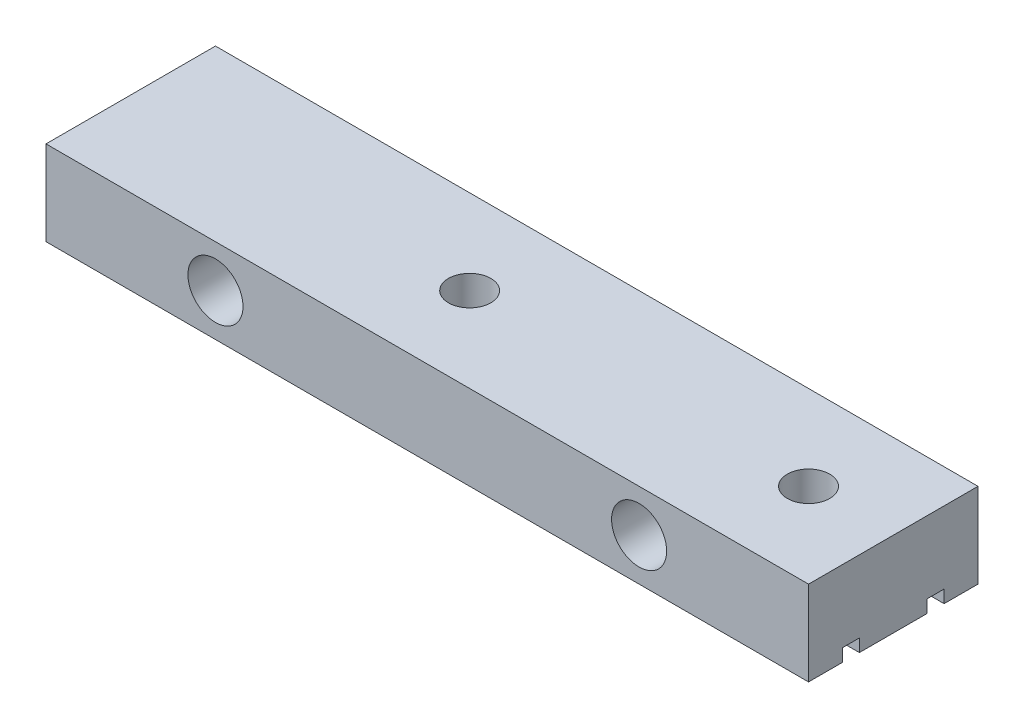
ISO-10303-21;
HEADER;
FILE_DESCRIPTION(('STEP AP214'),'2;1');
FILE_NAME('part.step','',(''),(''),'','','');
FILE_SCHEMA(('AUTOMOTIVE_DESIGN { 1 0 10303 214 1 1 1 1 }'));
ENDSEC;
DATA;
#1=APPLICATION_CONTEXT('core data for automotive mechanical design processes');
#2=APPLICATION_PROTOCOL_DEFINITION('international standard','automotive_design',2000,#1);
#3=PRODUCT_CONTEXT('',#1,'mechanical');
#4=PRODUCT('Part','Part','',(#3));
#5=PRODUCT_RELATED_PRODUCT_CATEGORY('part','',(#4));
#6=PRODUCT_DEFINITION_FORMATION('','',#4);
#7=PRODUCT_DEFINITION_CONTEXT('part definition',#1,'design');
#8=PRODUCT_DEFINITION('design','',#6,#7);
#9=PRODUCT_DEFINITION_SHAPE('','',#8);
#10=(LENGTH_UNIT() NAMED_UNIT(*) SI_UNIT(.MILLI.,.METRE.));
#11=(NAMED_UNIT(*) PLANE_ANGLE_UNIT() SI_UNIT($,.RADIAN.));
#12=(NAMED_UNIT(*) SI_UNIT($,.STERADIAN.) SOLID_ANGLE_UNIT());
#13=UNCERTAINTY_MEASURE_WITH_UNIT(LENGTH_MEASURE(1.E-05),#10,'distance_accuracy_value','');
#14=(GEOMETRIC_REPRESENTATION_CONTEXT(3) GLOBAL_UNCERTAINTY_ASSIGNED_CONTEXT((#13)) GLOBAL_UNIT_ASSIGNED_CONTEXT((#10,
#11,#12)) REPRESENTATION_CONTEXT('',''));
#15=CARTESIAN_POINT('',(0.,0.,0.));
#16=DIRECTION('',(0.,0.,1.));
#17=DIRECTION('',(1.,0.,0.));
#18=AXIS2_PLACEMENT_3D('',#15,#16,#17);
#19=CARTESIAN_POINT('',(70.,5.,0.));
#20=DIRECTION('',(0.,0.,1.));
#21=DIRECTION('',(1.,0.,0.));
#22=AXIS2_PLACEMENT_3D('',#19,#20,#21);
#23=CYLINDRICAL_SURFACE('',#22,2.);
#24=CARTESIAN_POINT('',(70.,5.,14.));
#25=DIRECTION('',(0.,0.,1.));
#26=DIRECTION('',(1.,0.,0.));
#27=AXIS2_PLACEMENT_3D('',#24,#25,#26);
#28=CIRCLE('',#27,2.);
#29=CARTESIAN_POINT('',(72.,5.,14.));
#30=VERTEX_POINT('',#29);
#31=EDGE_CURVE('E180',#30,#30,#28,.F.);
#32=ORIENTED_EDGE('',*,*,#31,.F.);
#33=EDGE_LOOP('',(#32));
#34=FACE_BOUND('',#33,.T.);
#35=CARTESIAN_POINT('',(70.,5.,6.));
#36=DIRECTION('',(0.,0.,-1.));
#37=DIRECTION('',(-1.,0.,0.));
#38=AXIS2_PLACEMENT_3D('',#35,#36,#37);
#39=CIRCLE('',#38,2.);
#40=CARTESIAN_POINT('',(68.,5.,6.));
#41=VERTEX_POINT('',#40);
#42=EDGE_CURVE('E42',#41,#41,#39,.F.);
#43=ORIENTED_EDGE('',*,*,#42,.F.);
#44=EDGE_LOOP('',(#43));
#45=FACE_BOUND('',#44,.T.);
#46=ADVANCED_FACE('F38',(#34,#45),#23,.F.);
#47=CARTESIAN_POINT('',(20.,5.,0.));
#48=DIRECTION('',(0.,0.,1.));
#49=DIRECTION('',(1.,0.,0.));
#50=AXIS2_PLACEMENT_3D('',#47,#48,#49);
#51=CYLINDRICAL_SURFACE('',#50,2.);
#52=CARTESIAN_POINT('',(20.,5.,14.));
#53=DIRECTION('',(0.,0.,1.));
#54=DIRECTION('',(1.,0.,0.));
#55=AXIS2_PLACEMENT_3D('',#52,#53,#54);
#56=CIRCLE('',#55,2.);
#57=CARTESIAN_POINT('',(22.,5.,14.));
#58=VERTEX_POINT('',#57);
#59=EDGE_CURVE('E176',#58,#58,#56,.F.);
#60=ORIENTED_EDGE('',*,*,#59,.F.);
#61=EDGE_LOOP('',(#60));
#62=FACE_BOUND('',#61,.T.);
#63=CARTESIAN_POINT('',(20.,5.,6.));
#64=DIRECTION('',(0.,0.,-1.));
#65=DIRECTION('',(-1.,0.,0.));
#66=AXIS2_PLACEMENT_3D('',#63,#64,#65);
#67=CIRCLE('',#66,2.);
#68=CARTESIAN_POINT('',(18.,5.,6.));
#69=VERTEX_POINT('',#68);
#70=EDGE_CURVE('E185',#69,#69,#67,.F.);
#71=ORIENTED_EDGE('',*,*,#70,.F.);
#72=EDGE_LOOP('',(#71));
#73=FACE_BOUND('',#72,.T.);
#74=ADVANCED_FACE('F368',(#62,#73),#51,.F.);
#75=CARTESIAN_POINT('',(0.,0.,20.));
#76=DIRECTION('',(0.,1.,0.));
#77=DIRECTION('',(-1.,0.,0.));
#78=AXIS2_PLACEMENT_3D('',#75,#76,#77);
#79=PLANE('',#78);
#80=DIRECTION('',(0.,0.,-1.));
#81=VECTOR('',#80,1.);
#82=CARTESIAN_POINT('',(90.,0.,20.));
#83=LINE('',#82,#81);
#84=CARTESIAN_POINT('',(90.,0.,4.));
#85=VERTEX_POINT('',#84);
#86=CARTESIAN_POINT('',(90.,0.,0.));
#87=VERTEX_POINT('',#86);
#88=EDGE_CURVE('E145',#85,#87,#83,.T.);
#89=ORIENTED_EDGE('',*,*,#88,.F.);
#90=DIRECTION('',(-1.,0.,0.));
#91=VECTOR('',#90,1.);
#92=CARTESIAN_POINT('',(90.,0.,4.));
#93=LINE('',#92,#91);
#94=CARTESIAN_POINT('',(0.,0.,4.));
#95=VERTEX_POINT('',#94);
#96=EDGE_CURVE('E131',#85,#95,#93,.T.);
#97=ORIENTED_EDGE('',*,*,#96,.T.);
#98=DIRECTION('',(0.,0.,-1.));
#99=VECTOR('',#98,1.);
#100=CARTESIAN_POINT('',(0.,0.,20.));
#101=LINE('',#100,#99);
#102=CARTESIAN_POINT('',(0.,0.,0.));
#103=VERTEX_POINT('',#102);
#104=EDGE_CURVE('E50',#95,#103,#101,.T.);
#105=ORIENTED_EDGE('',*,*,#104,.T.);
#106=DIRECTION('',(1.,0.,0.));
#107=VECTOR('',#106,1.);
#108=CARTESIAN_POINT('',(0.,0.,0.));
#109=LINE('',#108,#107);
#110=EDGE_CURVE('E154',#103,#87,#109,.T.);
#111=ORIENTED_EDGE('',*,*,#110,.T.);
#112=EDGE_LOOP('',(#89,#97,#105,#111));
#113=FACE_BOUND('',#112,.T.);
#114=ADVANCED_FACE('F152',(#113),#79,.F.);
#115=CARTESIAN_POINT('',(0.,0.,14.));
#116=VERTEX_POINT('',#115);
#117=CARTESIAN_POINT('',(0.,0.,6.));
#118=VERTEX_POINT('',#117);
#119=EDGE_CURVE('E48',#116,#118,#101,.T.);
#120=ORIENTED_EDGE('',*,*,#119,.T.);
#121=DIRECTION('',(-1.,0.,0.));
#122=VECTOR('',#121,1.);
#123=CARTESIAN_POINT('',(90.,0.,6.));
#124=LINE('',#123,#122);
#125=CARTESIAN_POINT('',(90.,0.,6.));
#126=VERTEX_POINT('',#125);
#127=EDGE_CURVE('E141',#126,#118,#124,.T.);
#128=ORIENTED_EDGE('',*,*,#127,.F.);
#129=CARTESIAN_POINT('',(90.,0.,14.));
#130=VERTEX_POINT('',#129);
#131=EDGE_CURVE('E157',#130,#126,#83,.T.);
#132=ORIENTED_EDGE('',*,*,#131,.F.);
#133=DIRECTION('',(-1.,0.,0.));
#134=VECTOR('',#133,1.);
#135=CARTESIAN_POINT('',(90.,0.,14.));
#136=LINE('',#135,#134);
#137=EDGE_CURVE('E275',#130,#116,#136,.T.);
#138=ORIENTED_EDGE('',*,*,#137,.T.);
#139=EDGE_LOOP('',(#120,#128,#132,#138));
#140=FACE_BOUND('',#139,.T.);
#141=ADVANCED_FACE('F351',(#140),#79,.F.);
#142=CARTESIAN_POINT('',(0.,0.,20.));
#143=DIRECTION('',(1.,0.,0.));
#144=DIRECTION('',(0.,0.,-1.));
#145=AXIS2_PLACEMENT_3D('',#142,#143,#144);
#146=PLANE('',#145);
#147=ORIENTED_EDGE('',*,*,#104,.F.);
#148=DIRECTION('',(0.,-1.,0.));
#149=VECTOR('',#148,1.);
#150=CARTESIAN_POINT('',(0.,0.,4.));
#151=LINE('',#150,#149);
#152=CARTESIAN_POINT('',(0.,1.5,4.));
#153=VERTEX_POINT('',#152);
#154=EDGE_CURVE('E136',#153,#95,#151,.T.);
#155=ORIENTED_EDGE('',*,*,#154,.F.);
#156=DIRECTION('',(0.,0.,-1.));
#157=VECTOR('',#156,1.);
#158=CARTESIAN_POINT('',(0.,1.5,4.));
#159=LINE('',#158,#157);
#160=CARTESIAN_POINT('',(0.,1.5,6.));
#161=VERTEX_POINT('',#160);
#162=EDGE_CURVE('E150',#161,#153,#159,.T.);
#163=ORIENTED_EDGE('',*,*,#162,.F.);
#164=DIRECTION('',(0.,1.,0.));
#165=VECTOR('',#164,1.);
#166=CARTESIAN_POINT('',(0.,0.,6.));
#167=LINE('',#166,#165);
#168=EDGE_CURVE('E248',#118,#161,#167,.T.);
#169=ORIENTED_EDGE('',*,*,#168,.F.);
#170=ORIENTED_EDGE('',*,*,#119,.F.);
#171=DIRECTION('',(0.,-1.,0.));
#172=VECTOR('',#171,1.);
#173=CARTESIAN_POINT('',(0.,0.,14.));
#174=LINE('',#173,#172);
#175=CARTESIAN_POINT('',(0.,1.5,14.));
#176=VERTEX_POINT('',#175);
#177=EDGE_CURVE('E240',#176,#116,#174,.T.);
#178=ORIENTED_EDGE('',*,*,#177,.F.);
#179=DIRECTION('',(0.,0.,-1.));
#180=VECTOR('',#179,1.);
#181=CARTESIAN_POINT('',(0.,1.5,14.));
#182=LINE('',#181,#180);
#183=CARTESIAN_POINT('',(0.,1.5,16.));
#184=VERTEX_POINT('',#183);
#185=EDGE_CURVE('E270',#184,#176,#182,.T.);
#186=ORIENTED_EDGE('',*,*,#185,.F.);
#187=DIRECTION('',(0.,1.,0.));
#188=VECTOR('',#187,1.);
#189=CARTESIAN_POINT('',(0.,0.,16.));
#190=LINE('',#189,#188);
#191=CARTESIAN_POINT('',(0.,0.,16.));
#192=VERTEX_POINT('',#191);
#193=EDGE_CURVE('E278',#192,#184,#190,.T.);
#194=ORIENTED_EDGE('',*,*,#193,.F.);
#195=CARTESIAN_POINT('',(0.,0.,20.));
#196=VERTEX_POINT('',#195);
#197=EDGE_CURVE('E11',#196,#192,#101,.T.);
#198=ORIENTED_EDGE('',*,*,#197,.F.);
#199=DIRECTION('',(0.,-1.,0.));
#200=VECTOR('',#199,1.);
#201=CARTESIAN_POINT('',(0.,0.,20.));
#202=LINE('',#201,#200);
#203=CARTESIAN_POINT('',(0.,10.,20.));
#204=VERTEX_POINT('',#203);
#205=EDGE_CURVE('E296',#204,#196,#202,.T.);
#206=ORIENTED_EDGE('',*,*,#205,.F.);
#207=DIRECTION('',(0.,0.,-1.));
#208=VECTOR('',#207,1.);
#209=CARTESIAN_POINT('',(0.,10.,20.));
#210=LINE('',#209,#208);
#211=CARTESIAN_POINT('',(0.,10.,0.));
#212=VERTEX_POINT('',#211);
#213=EDGE_CURVE('E165',#204,#212,#210,.T.);
#214=ORIENTED_EDGE('',*,*,#213,.T.);
#215=DIRECTION('',(0.,-1.,0.));
#216=VECTOR('',#215,1.);
#217=CARTESIAN_POINT('',(0.,0.,0.));
#218=LINE('',#217,#216);
#219=EDGE_CURVE('E259',#212,#103,#218,.T.);
#220=ORIENTED_EDGE('',*,*,#219,.T.);
#221=EDGE_LOOP('',(#147,#155,#163,#169,#170,#178,#186,#194,#198,#206,#214,#220));
#222=FACE_BOUND('',#221,.T.);
#223=ADVANCED_FACE('F40',(#222),#146,.F.);
#224=ORIENTED_EDGE('',*,*,#197,.T.);
#225=DIRECTION('',(-1.,0.,0.));
#226=VECTOR('',#225,1.);
#227=CARTESIAN_POINT('',(90.,0.,16.));
#228=LINE('',#227,#226);
#229=CARTESIAN_POINT('',(90.,0.,16.));
#230=VERTEX_POINT('',#229);
#231=EDGE_CURVE('E290',#230,#192,#228,.T.);
#232=ORIENTED_EDGE('',*,*,#231,.F.);
#233=CARTESIAN_POINT('',(90.,0.,20.));
#234=VERTEX_POINT('',#233);
#235=EDGE_CURVE('E160',#234,#230,#83,.T.);
#236=ORIENTED_EDGE('',*,*,#235,.F.);
#237=DIRECTION('',(1.,0.,0.));
#238=VECTOR('',#237,1.);
#239=CARTESIAN_POINT('',(0.,0.,20.));
#240=LINE('',#239,#238);
#241=EDGE_CURVE('E300',#196,#234,#240,.T.);
#242=ORIENTED_EDGE('',*,*,#241,.F.);
#243=EDGE_LOOP('',(#224,#232,#236,#242));
#244=FACE_BOUND('',#243,.T.);
#245=ADVANCED_FACE('F338',(#244),#79,.F.);
#246=CARTESIAN_POINT('',(90.,0.,20.));
#247=DIRECTION('',(-1.,0.,0.));
#248=DIRECTION('',(0.,0.,1.));
#249=AXIS2_PLACEMENT_3D('',#246,#247,#248);
#250=PLANE('',#249);
#251=DIRECTION('',(0.,0.,-1.));
#252=VECTOR('',#251,1.);
#253=CARTESIAN_POINT('',(90.,1.5,4.));
#254=LINE('',#253,#252);
#255=CARTESIAN_POINT('',(90.,1.5,6.));
#256=VERTEX_POINT('',#255);
#257=CARTESIAN_POINT('',(90.,1.5,4.));
#258=VERTEX_POINT('',#257);
#259=EDGE_CURVE('E57',#256,#258,#254,.T.);
#260=ORIENTED_EDGE('',*,*,#259,.T.);
#261=DIRECTION('',(0.,-1.,0.));
#262=VECTOR('',#261,1.);
#263=CARTESIAN_POINT('',(90.,0.,4.));
#264=LINE('',#263,#262);
#265=EDGE_CURVE('E134',#258,#85,#264,.T.);
#266=ORIENTED_EDGE('',*,*,#265,.T.);
#267=ORIENTED_EDGE('',*,*,#88,.T.);
#268=DIRECTION('',(0.,1.,0.));
#269=VECTOR('',#268,1.);
#270=CARTESIAN_POINT('',(90.,0.,0.));
#271=LINE('',#270,#269);
#272=CARTESIAN_POINT('',(90.,10.,0.));
#273=VERTEX_POINT('',#272);
#274=EDGE_CURVE('E315',#87,#273,#271,.T.);
#275=ORIENTED_EDGE('',*,*,#274,.T.);
#276=DIRECTION('',(0.,0.,-1.));
#277=VECTOR('',#276,1.);
#278=CARTESIAN_POINT('',(90.,10.,20.));
#279=LINE('',#278,#277);
#280=CARTESIAN_POINT('',(90.,10.,20.));
#281=VERTEX_POINT('',#280);
#282=EDGE_CURVE('E158',#281,#273,#279,.T.);
#283=ORIENTED_EDGE('',*,*,#282,.F.);
#284=DIRECTION('',(0.,1.,0.));
#285=VECTOR('',#284,1.);
#286=CARTESIAN_POINT('',(90.,0.,20.));
#287=LINE('',#286,#285);
#288=EDGE_CURVE('E304',#234,#281,#287,.T.);
#289=ORIENTED_EDGE('',*,*,#288,.F.);
#290=ORIENTED_EDGE('',*,*,#235,.T.);
#291=DIRECTION('',(0.,1.,0.));
#292=VECTOR('',#291,1.);
#293=CARTESIAN_POINT('',(90.,0.,16.));
#294=LINE('',#293,#292);
#295=CARTESIAN_POINT('',(90.,1.5,16.));
#296=VERTEX_POINT('',#295);
#297=EDGE_CURVE('E269',#230,#296,#294,.T.);
#298=ORIENTED_EDGE('',*,*,#297,.T.);
#299=DIRECTION('',(0.,0.,-1.));
#300=VECTOR('',#299,1.);
#301=CARTESIAN_POINT('',(90.,1.5,14.));
#302=LINE('',#301,#300);
#303=CARTESIAN_POINT('',(90.,1.5,14.));
#304=VERTEX_POINT('',#303);
#305=EDGE_CURVE('E65',#296,#304,#302,.T.);
#306=ORIENTED_EDGE('',*,*,#305,.T.);
#307=DIRECTION('',(0.,-1.,0.));
#308=VECTOR('',#307,1.);
#309=CARTESIAN_POINT('',(90.,0.,14.));
#310=LINE('',#309,#308);
#311=EDGE_CURVE('E265',#304,#130,#310,.T.);
#312=ORIENTED_EDGE('',*,*,#311,.T.);
#313=ORIENTED_EDGE('',*,*,#131,.T.);
#314=DIRECTION('',(0.,1.,0.));
#315=VECTOR('',#314,1.);
#316=CARTESIAN_POINT('',(90.,0.,6.));
#317=LINE('',#316,#315);
#318=EDGE_CURVE('E149',#126,#256,#317,.T.);
#319=ORIENTED_EDGE('',*,*,#318,.T.);
#320=EDGE_LOOP('',(#260,#266,#267,#275,#283,#289,#290,#298,#306,#312,#313,#319));
#321=FACE_BOUND('',#320,.T.);
#322=ADVANCED_FACE('F144',(#321),#250,.F.);
#323=CARTESIAN_POINT('',(0.,10.,20.));
#324=DIRECTION('',(0.,-1.,0.));
#325=DIRECTION('',(0.,0.,-1.));
#326=AXIS2_PLACEMENT_3D('',#323,#324,#325);
#327=PLANE('',#326);
#328=CARTESIAN_POINT('',(40.,10.,10.));
#329=DIRECTION('',(0.,1.,0.));
#330=DIRECTION('',(0.,0.,1.));
#331=AXIS2_PLACEMENT_3D('',#328,#329,#330);
#332=CIRCLE('',#331,2.49999999999999);
#333=CARTESIAN_POINT('',(40.,10.,12.5));
#334=VERTEX_POINT('',#333);
#335=EDGE_CURVE('E184',#334,#334,#332,.T.);
#336=ORIENTED_EDGE('',*,*,#335,.F.);
#337=EDGE_LOOP('',(#336));
#338=FACE_BOUND('',#337,.T.);
#339=CARTESIAN_POINT('',(80.,10.,10.));
#340=DIRECTION('',(0.,1.,0.));
#341=DIRECTION('',(0.,0.,1.));
#342=AXIS2_PLACEMENT_3D('',#339,#340,#341);
#343=CIRCLE('',#342,2.49999999999999);
#344=CARTESIAN_POINT('',(80.,10.,12.5));
#345=VERTEX_POINT('',#344);
#346=EDGE_CURVE('E233',#345,#345,#343,.T.);
#347=ORIENTED_EDGE('',*,*,#346,.F.);
#348=EDGE_LOOP('',(#347));
#349=FACE_BOUND('',#348,.T.);
#350=DIRECTION('',(-1.,0.,0.));
#351=VECTOR('',#350,1.);
#352=CARTESIAN_POINT('',(0.,10.,0.));
#353=LINE('',#352,#351);
#354=EDGE_CURVE('E301',#273,#212,#353,.T.);
#355=ORIENTED_EDGE('',*,*,#354,.T.);
#356=ORIENTED_EDGE('',*,*,#213,.F.);
#357=DIRECTION('',(-1.,0.,0.));
#358=VECTOR('',#357,1.);
#359=CARTESIAN_POINT('',(0.,10.,20.));
#360=LINE('',#359,#358);
#361=EDGE_CURVE('E307',#281,#204,#360,.T.);
#362=ORIENTED_EDGE('',*,*,#361,.F.);
#363=ORIENTED_EDGE('',*,*,#282,.T.);
#364=EDGE_LOOP('',(#355,#356,#362,#363));
#365=FACE_BOUND('',#364,.T.);
#366=ADVANCED_FACE('F333',(#338,#349,#365),#327,.F.);
#367=CARTESIAN_POINT('',(0.,0.,20.));
#368=DIRECTION('',(0.,0.,-1.));
#369=DIRECTION('',(-1.,0.,0.));
#370=AXIS2_PLACEMENT_3D('',#367,#368,#369);
#371=PLANE('',#370);
#372=CARTESIAN_POINT('',(70.,5.,20.));
#373=DIRECTION('',(0.,0.,1.));
#374=DIRECTION('',(1.,0.,0.));
#375=AXIS2_PLACEMENT_3D('',#372,#373,#374);
#376=CIRCLE('',#375,3.25000000000001);
#377=CARTESIAN_POINT('',(73.25,5.,20.));
#378=VERTEX_POINT('',#377);
#379=EDGE_CURVE('E215',#378,#378,#376,.T.);
#380=ORIENTED_EDGE('',*,*,#379,.F.);
#381=EDGE_LOOP('',(#380));
#382=FACE_BOUND('',#381,.T.);
#383=CARTESIAN_POINT('',(20.,5.,20.));
#384=DIRECTION('',(0.,0.,1.));
#385=DIRECTION('',(1.,0.,0.));
#386=AXIS2_PLACEMENT_3D('',#383,#384,#385);
#387=CIRCLE('',#386,3.25);
#388=CARTESIAN_POINT('',(23.25,5.,20.));
#389=VERTEX_POINT('',#388);
#390=EDGE_CURVE('E219',#389,#389,#387,.T.);
#391=ORIENTED_EDGE('',*,*,#390,.F.);
#392=EDGE_LOOP('',(#391));
#393=FACE_BOUND('',#392,.T.);
#394=ORIENTED_EDGE('',*,*,#205,.T.);
#395=ORIENTED_EDGE('',*,*,#241,.T.);
#396=ORIENTED_EDGE('',*,*,#288,.T.);
#397=ORIENTED_EDGE('',*,*,#361,.T.);
#398=EDGE_LOOP('',(#394,#395,#396,#397));
#399=FACE_BOUND('',#398,.T.);
#400=ADVANCED_FACE('F335',(#382,#393,#399),#371,.F.);
#401=CARTESIAN_POINT('',(0.,0.,0.));
#402=DIRECTION('',(0.,0.,-1.));
#403=DIRECTION('',(-1.,0.,0.));
#404=AXIS2_PLACEMENT_3D('',#401,#402,#403);
#405=PLANE('',#404);
#406=CARTESIAN_POINT('',(70.,5.,0.));
#407=DIRECTION('',(0.,0.,-1.));
#408=DIRECTION('',(-1.,0.,0.));
#409=AXIS2_PLACEMENT_3D('',#406,#407,#408);
#410=CIRCLE('',#409,3.25000000000001);
#411=CARTESIAN_POINT('',(66.75,5.,0.));
#412=VERTEX_POINT('',#411);
#413=EDGE_CURVE('E196',#412,#412,#410,.T.);
#414=ORIENTED_EDGE('',*,*,#413,.F.);
#415=EDGE_LOOP('',(#414));
#416=FACE_BOUND('',#415,.T.);
#417=CARTESIAN_POINT('',(20.,5.,0.));
#418=DIRECTION('',(0.,0.,-1.));
#419=DIRECTION('',(-1.,0.,0.));
#420=AXIS2_PLACEMENT_3D('',#417,#418,#419);
#421=CIRCLE('',#420,3.25);
#422=CARTESIAN_POINT('',(16.75,5.,0.));
#423=VERTEX_POINT('',#422);
#424=EDGE_CURVE('E208',#423,#423,#421,.T.);
#425=ORIENTED_EDGE('',*,*,#424,.F.);
#426=EDGE_LOOP('',(#425));
#427=FACE_BOUND('',#426,.T.);
#428=ORIENTED_EDGE('',*,*,#219,.F.);
#429=ORIENTED_EDGE('',*,*,#354,.F.);
#430=ORIENTED_EDGE('',*,*,#274,.F.);
#431=ORIENTED_EDGE('',*,*,#110,.F.);
#432=EDGE_LOOP('',(#428,#429,#430,#431));
#433=FACE_BOUND('',#432,.T.);
#434=ADVANCED_FACE('F331',(#416,#427,#433),#405,.T.);
#435=CARTESIAN_POINT('',(90.,0.,14.));
#436=DIRECTION('',(0.,0.,-1.));
#437=DIRECTION('',(-1.,0.,0.));
#438=AXIS2_PLACEMENT_3D('',#435,#436,#437);
#439=PLANE('',#438);
#440=ORIENTED_EDGE('',*,*,#177,.T.);
#441=ORIENTED_EDGE('',*,*,#137,.F.);
#442=ORIENTED_EDGE('',*,*,#311,.F.);
#443=DIRECTION('',(-1.,0.,0.));
#444=VECTOR('',#443,1.);
#445=CARTESIAN_POINT('',(90.,1.5,14.));
#446=LINE('',#445,#444);
#447=EDGE_CURVE('E249',#304,#176,#446,.T.);
#448=ORIENTED_EDGE('',*,*,#447,.T.);
#449=EDGE_LOOP('',(#440,#441,#442,#448));
#450=FACE_BOUND('',#449,.T.);
#451=ADVANCED_FACE('F443',(#450),#439,.F.);
#452=CARTESIAN_POINT('',(90.,1.5,14.));
#453=DIRECTION('',(0.,1.,0.));
#454=DIRECTION('',(0.,0.,1.));
#455=AXIS2_PLACEMENT_3D('',#452,#453,#454);
#456=PLANE('',#455);
#457=ORIENTED_EDGE('',*,*,#185,.T.);
#458=ORIENTED_EDGE('',*,*,#447,.F.);
#459=ORIENTED_EDGE('',*,*,#305,.F.);
#460=DIRECTION('',(-1.,0.,0.));
#461=VECTOR('',#460,1.);
#462=CARTESIAN_POINT('',(90.,1.5,16.));
#463=LINE('',#462,#461);
#464=EDGE_CURVE('E287',#296,#184,#463,.T.);
#465=ORIENTED_EDGE('',*,*,#464,.T.);
#466=EDGE_LOOP('',(#457,#458,#459,#465));
#467=FACE_BOUND('',#466,.T.);
#468=ADVANCED_FACE('F345',(#467),#456,.F.);
#469=CARTESIAN_POINT('',(90.,0.,16.));
#470=DIRECTION('',(0.,0.,1.));
#471=DIRECTION('',(1.,0.,0.));
#472=AXIS2_PLACEMENT_3D('',#469,#470,#471);
#473=PLANE('',#472);
#474=ORIENTED_EDGE('',*,*,#193,.T.);
#475=ORIENTED_EDGE('',*,*,#464,.F.);
#476=ORIENTED_EDGE('',*,*,#297,.F.);
#477=ORIENTED_EDGE('',*,*,#231,.T.);
#478=EDGE_LOOP('',(#474,#475,#476,#477));
#479=FACE_BOUND('',#478,.T.);
#480=ADVANCED_FACE('F341',(#479),#473,.F.);
#481=CARTESIAN_POINT('',(90.,0.,4.));
#482=DIRECTION('',(0.,0.,-1.));
#483=DIRECTION('',(0.,1.,0.));
#484=AXIS2_PLACEMENT_3D('',#481,#482,#483);
#485=PLANE('',#484);
#486=ORIENTED_EDGE('',*,*,#154,.T.);
#487=ORIENTED_EDGE('',*,*,#96,.F.);
#488=ORIENTED_EDGE('',*,*,#265,.F.);
#489=DIRECTION('',(-1.,0.,0.));
#490=VECTOR('',#489,1.);
#491=CARTESIAN_POINT('',(90.,1.5,4.));
#492=LINE('',#491,#490);
#493=EDGE_CURVE('E256',#258,#153,#492,.T.);
#494=ORIENTED_EDGE('',*,*,#493,.T.);
#495=EDGE_LOOP('',(#486,#487,#488,#494));
#496=FACE_BOUND('',#495,.T.);
#497=ADVANCED_FACE('F133',(#496),#485,.F.);
#498=CARTESIAN_POINT('',(90.,1.5,4.));
#499=DIRECTION('',(0.,1.,0.));
#500=DIRECTION('',(0.,0.,1.));
#501=AXIS2_PLACEMENT_3D('',#498,#499,#500);
#502=PLANE('',#501);
#503=ORIENTED_EDGE('',*,*,#162,.T.);
#504=ORIENTED_EDGE('',*,*,#493,.F.);
#505=ORIENTED_EDGE('',*,*,#259,.F.);
#506=DIRECTION('',(-1.,0.,0.));
#507=VECTOR('',#506,1.);
#508=CARTESIAN_POINT('',(90.,1.5,6.));
#509=LINE('',#508,#507);
#510=EDGE_CURVE('E260',#256,#161,#509,.T.);
#511=ORIENTED_EDGE('',*,*,#510,.T.);
#512=EDGE_LOOP('',(#503,#504,#505,#511));
#513=FACE_BOUND('',#512,.T.);
#514=ADVANCED_FACE('F356',(#513),#502,.F.);
#515=CARTESIAN_POINT('',(90.,0.,6.));
#516=DIRECTION('',(0.,0.,1.));
#517=DIRECTION('',(0.,-1.,0.));
#518=AXIS2_PLACEMENT_3D('',#515,#516,#517);
#519=PLANE('',#518);
#520=ORIENTED_EDGE('',*,*,#168,.T.);
#521=ORIENTED_EDGE('',*,*,#510,.F.);
#522=ORIENTED_EDGE('',*,*,#318,.F.);
#523=ORIENTED_EDGE('',*,*,#127,.T.);
#524=EDGE_LOOP('',(#520,#521,#522,#523));
#525=FACE_BOUND('',#524,.T.);
#526=ADVANCED_FACE('F354',(#525),#519,.F.);
#527=CARTESIAN_POINT('',(80.,2.00000000000001,10.));
#528=DIRECTION('',(0.,-1.,0.));
#529=DIRECTION('',(0.,0.,-1.));
#530=AXIS2_PLACEMENT_3D('',#527,#528,#529);
#531=PLANE('',#530);
#532=CARTESIAN_POINT('',(80.,2.00000000000001,10.));
#533=DIRECTION('',(0.,1.,0.));
#534=DIRECTION('',(0.,0.,1.));
#535=AXIS2_PLACEMENT_3D('',#532,#533,#534);
#536=CIRCLE('',#535,2.49999999999999);
#537=CARTESIAN_POINT('',(80.,2.00000000000001,12.5));
#538=VERTEX_POINT('',#537);
#539=EDGE_CURVE('E237',#538,#538,#536,.T.);
#540=ORIENTED_EDGE('',*,*,#539,.T.);
#541=EDGE_LOOP('',(#540));
#542=FACE_BOUND('',#541,.T.);
#543=ADVANCED_FACE('F363',(#542),#531,.F.);
#544=CARTESIAN_POINT('',(80.,10.,10.));
#545=DIRECTION('',(0.,1.,0.));
#546=DIRECTION('',(0.,0.,1.));
#547=AXIS2_PLACEMENT_3D('',#544,#545,#546);
#548=CYLINDRICAL_SURFACE('',#547,2.49999999999999);
#549=ORIENTED_EDGE('',*,*,#539,.F.);
#550=EDGE_LOOP('',(#549));
#551=FACE_BOUND('',#550,.T.);
#552=ORIENTED_EDGE('',*,*,#346,.T.);
#553=EDGE_LOOP('',(#552));
#554=FACE_BOUND('',#553,.T.);
#555=ADVANCED_FACE('F388',(#551,#554),#548,.F.);
#556=CARTESIAN_POINT('',(40.,2.00000000000001,10.));
#557=DIRECTION('',(0.,-1.,0.));
#558=DIRECTION('',(0.,0.,-1.));
#559=AXIS2_PLACEMENT_3D('',#556,#557,#558);
#560=PLANE('',#559);
#561=CARTESIAN_POINT('',(40.,2.00000000000001,10.));
#562=DIRECTION('',(0.,1.,0.));
#563=DIRECTION('',(0.,0.,1.));
#564=AXIS2_PLACEMENT_3D('',#561,#562,#563);
#565=CIRCLE('',#564,2.49999999999999);
#566=CARTESIAN_POINT('',(40.,2.00000000000001,12.5));
#567=VERTEX_POINT('',#566);
#568=EDGE_CURVE('E229',#567,#567,#565,.T.);
#569=ORIENTED_EDGE('',*,*,#568,.T.);
#570=EDGE_LOOP('',(#569));
#571=FACE_BOUND('',#570,.T.);
#572=ADVANCED_FACE('F384',(#571),#560,.F.);
#573=CARTESIAN_POINT('',(40.,10.,10.));
#574=DIRECTION('',(0.,1.,0.));
#575=DIRECTION('',(0.,0.,1.));
#576=AXIS2_PLACEMENT_3D('',#573,#574,#575);
#577=CYLINDRICAL_SURFACE('',#576,2.49999999999999);
#578=ORIENTED_EDGE('',*,*,#568,.F.);
#579=EDGE_LOOP('',(#578));
#580=FACE_BOUND('',#579,.T.);
#581=ORIENTED_EDGE('',*,*,#335,.T.);
#582=EDGE_LOOP('',(#581));
#583=FACE_BOUND('',#582,.T.);
#584=ADVANCED_FACE('F381',(#580,#583),#577,.F.);
#585=CARTESIAN_POINT('',(20.,5.,14.));
#586=DIRECTION('',(0.,0.,1.));
#587=DIRECTION('',(1.,0.,0.));
#588=AXIS2_PLACEMENT_3D('',#585,#586,#587);
#589=PLANE('',#588);
#590=CARTESIAN_POINT('',(20.,5.,14.));
#591=DIRECTION('',(0.,0.,1.));
#592=DIRECTION('',(1.,0.,0.));
#593=AXIS2_PLACEMENT_3D('',#590,#591,#592);
#594=CIRCLE('',#593,3.25);
#595=CARTESIAN_POINT('',(23.25,5.,14.));
#596=VERTEX_POINT('',#595);
#597=EDGE_CURVE('E194',#596,#596,#594,.T.);
#598=ORIENTED_EDGE('',*,*,#597,.T.);
#599=EDGE_LOOP('',(#598));
#600=FACE_BOUND('',#599,.T.);
#601=ORIENTED_EDGE('',*,*,#59,.T.);
#602=EDGE_LOOP('',(#601));
#603=FACE_BOUND('',#602,.T.);
#604=ADVANCED_FACE('F383',(#600,#603),#589,.T.);
#605=CARTESIAN_POINT('',(20.,5.,14.));
#606=DIRECTION('',(0.,0.,1.));
#607=DIRECTION('',(1.,0.,0.));
#608=AXIS2_PLACEMENT_3D('',#605,#606,#607);
#609=CYLINDRICAL_SURFACE('',#608,3.25);
#610=ORIENTED_EDGE('',*,*,#597,.F.);
#611=EDGE_LOOP('',(#610));
#612=FACE_BOUND('',#611,.T.);
#613=ORIENTED_EDGE('',*,*,#390,.T.);
#614=EDGE_LOOP('',(#613));
#615=FACE_BOUND('',#614,.T.);
#616=ADVANCED_FACE('F518',(#612,#615),#609,.F.);
#617=CARTESIAN_POINT('',(70.,5.,14.));
#618=DIRECTION('',(0.,0.,1.));
#619=DIRECTION('',(1.,0.,0.));
#620=AXIS2_PLACEMENT_3D('',#617,#618,#619);
#621=PLANE('',#620);
#622=CARTESIAN_POINT('',(70.,5.,14.));
#623=DIRECTION('',(0.,0.,1.));
#624=DIRECTION('',(1.,0.,0.));
#625=AXIS2_PLACEMENT_3D('',#622,#623,#624);
#626=CIRCLE('',#625,3.25000000000001);
#627=CARTESIAN_POINT('',(73.25,5.,14.));
#628=VERTEX_POINT('',#627);
#629=EDGE_CURVE('E181',#628,#628,#626,.T.);
#630=ORIENTED_EDGE('',*,*,#629,.T.);
#631=EDGE_LOOP('',(#630));
#632=FACE_BOUND('',#631,.T.);
#633=ORIENTED_EDGE('',*,*,#31,.T.);
#634=EDGE_LOOP('',(#633));
#635=FACE_BOUND('',#634,.T.);
#636=ADVANCED_FACE('F527',(#632,#635),#621,.T.);
#637=CARTESIAN_POINT('',(70.,5.,14.));
#638=DIRECTION('',(0.,0.,1.));
#639=DIRECTION('',(1.,0.,0.));
#640=AXIS2_PLACEMENT_3D('',#637,#638,#639);
#641=CYLINDRICAL_SURFACE('',#640,3.25000000000001);
#642=ORIENTED_EDGE('',*,*,#629,.F.);
#643=EDGE_LOOP('',(#642));
#644=FACE_BOUND('',#643,.T.);
#645=ORIENTED_EDGE('',*,*,#379,.T.);
#646=EDGE_LOOP('',(#645));
#647=FACE_BOUND('',#646,.T.);
#648=ADVANCED_FACE('F537',(#644,#647),#641,.F.);
#649=CARTESIAN_POINT('',(20.,5.,6.));
#650=DIRECTION('',(0.,0.,-1.));
#651=DIRECTION('',(-1.,0.,0.));
#652=AXIS2_PLACEMENT_3D('',#649,#650,#651);
#653=PLANE('',#652);
#654=CARTESIAN_POINT('',(20.,5.,6.));
#655=DIRECTION('',(0.,0.,-1.));
#656=DIRECTION('',(-1.,0.,0.));
#657=AXIS2_PLACEMENT_3D('',#654,#655,#656);
#658=CIRCLE('',#657,3.25);
#659=CARTESIAN_POINT('',(16.75,5.,6.));
#660=VERTEX_POINT('',#659);
#661=EDGE_CURVE('E202',#660,#660,#658,.T.);
#662=ORIENTED_EDGE('',*,*,#661,.T.);
#663=EDGE_LOOP('',(#662));
#664=FACE_BOUND('',#663,.T.);
#665=ORIENTED_EDGE('',*,*,#70,.T.);
#666=EDGE_LOOP('',(#665));
#667=FACE_BOUND('',#666,.T.);
#668=ADVANCED_FACE('F546',(#664,#667),#653,.T.);
#669=CARTESIAN_POINT('',(20.,5.,6.));
#670=DIRECTION('',(0.,0.,-1.));
#671=DIRECTION('',(-1.,0.,0.));
#672=AXIS2_PLACEMENT_3D('',#669,#670,#671);
#673=CYLINDRICAL_SURFACE('',#672,3.25);
#674=ORIENTED_EDGE('',*,*,#661,.F.);
#675=EDGE_LOOP('',(#674));
#676=FACE_BOUND('',#675,.T.);
#677=ORIENTED_EDGE('',*,*,#424,.T.);
#678=EDGE_LOOP('',(#677));
#679=FACE_BOUND('',#678,.T.);
#680=ADVANCED_FACE('F572',(#676,#679),#673,.F.);
#681=CARTESIAN_POINT('',(70.,5.,6.));
#682=DIRECTION('',(0.,0.,-1.));
#683=DIRECTION('',(-1.,0.,0.));
#684=AXIS2_PLACEMENT_3D('',#681,#682,#683);
#685=PLANE('',#684);
#686=CARTESIAN_POINT('',(70.,5.,6.));
#687=DIRECTION('',(0.,0.,-1.));
#688=DIRECTION('',(-1.,0.,0.));
#689=AXIS2_PLACEMENT_3D('',#686,#687,#688);
#690=CIRCLE('',#689,3.25000000000001);
#691=CARTESIAN_POINT('',(66.75,5.,6.));
#692=VERTEX_POINT('',#691);
#693=EDGE_CURVE('E188',#692,#692,#690,.T.);
#694=ORIENTED_EDGE('',*,*,#693,.T.);
#695=EDGE_LOOP('',(#694));
#696=FACE_BOUND('',#695,.T.);
#697=ORIENTED_EDGE('',*,*,#42,.T.);
#698=EDGE_LOOP('',(#697));
#699=FACE_BOUND('',#698,.T.);
#700=ADVANCED_FACE('F582',(#696,#699),#685,.T.);
#701=CARTESIAN_POINT('',(70.,5.,6.));
#702=DIRECTION('',(0.,0.,-1.));
#703=DIRECTION('',(-1.,0.,0.));
#704=AXIS2_PLACEMENT_3D('',#701,#702,#703);
#705=CYLINDRICAL_SURFACE('',#704,3.25000000000001);
#706=ORIENTED_EDGE('',*,*,#693,.F.);
#707=EDGE_LOOP('',(#706));
#708=FACE_BOUND('',#707,.T.);
#709=ORIENTED_EDGE('',*,*,#413,.T.);
#710=EDGE_LOOP('',(#709));
#711=FACE_BOUND('',#710,.T.);
#712=ADVANCED_FACE('F592',(#708,#711),#705,.F.);
#713=CLOSED_SHELL('',(#46,#74,#114,#141,#223,#245,#322,#366,#400,#434,#451,#468,#480,#497,#514,
#526,#543,#555,#572,#584,#604,#616,#636,#648,#668,#680,#700,#712));
#714=MANIFOLD_SOLID_BREP('B2',#713);
#715=ADVANCED_BREP_SHAPE_REPRESENTATION('',(#18,#714),#14);
#716=SHAPE_DEFINITION_REPRESENTATION(#9,#715);
ENDSEC;
END-ISO-10303-21;
